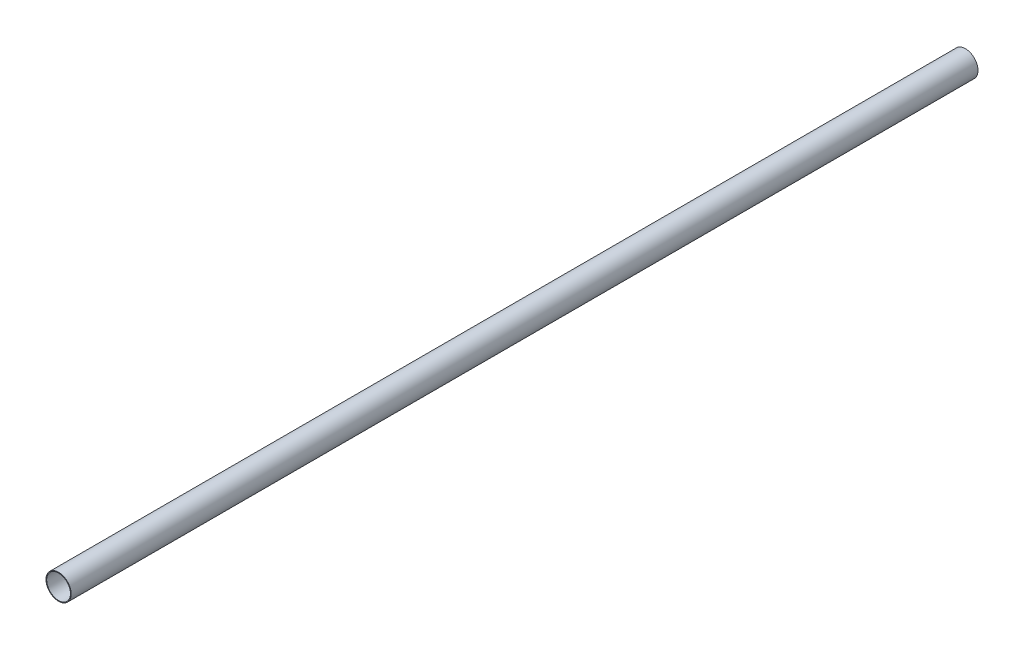
ISO-10303-21;
HEADER;
FILE_DESCRIPTION(('STEP AP214'),'2;1');
FILE_NAME('part.step','',(''),(''),'','','');
FILE_SCHEMA(('AUTOMOTIVE_DESIGN { 1 0 10303 214 1 1 1 1 }'));
ENDSEC;
DATA;
#1=APPLICATION_CONTEXT('core data for automotive mechanical design processes');
#2=APPLICATION_PROTOCOL_DEFINITION('international standard','automotive_design',2000,#1);
#3=PRODUCT_CONTEXT('',#1,'mechanical');
#4=PRODUCT('Part','Part','',(#3));
#5=PRODUCT_RELATED_PRODUCT_CATEGORY('part','',(#4));
#6=PRODUCT_DEFINITION_FORMATION('','',#4);
#7=PRODUCT_DEFINITION_CONTEXT('part definition',#1,'design');
#8=PRODUCT_DEFINITION('design','',#6,#7);
#9=PRODUCT_DEFINITION_SHAPE('','',#8);
#10=(LENGTH_UNIT() NAMED_UNIT(*) SI_UNIT(.MILLI.,.METRE.));
#11=(NAMED_UNIT(*) PLANE_ANGLE_UNIT() SI_UNIT($,.RADIAN.));
#12=(NAMED_UNIT(*) SI_UNIT($,.STERADIAN.) SOLID_ANGLE_UNIT());
#13=UNCERTAINTY_MEASURE_WITH_UNIT(LENGTH_MEASURE(1.E-05),#10,'distance_accuracy_value','');
#14=(GEOMETRIC_REPRESENTATION_CONTEXT(3) GLOBAL_UNCERTAINTY_ASSIGNED_CONTEXT((#13)) GLOBAL_UNIT_ASSIGNED_CONTEXT((#10,
#11,#12)) REPRESENTATION_CONTEXT('',''));
#15=CARTESIAN_POINT('',(0.,0.,0.));
#16=DIRECTION('',(0.,0.,1.));
#17=DIRECTION('',(1.,0.,0.));
#18=AXIS2_PLACEMENT_3D('',#15,#16,#17);
#19=CARTESIAN_POINT('',(0.,0.,457.2));
#20=DIRECTION('',(0.,0.,1.));
#21=DIRECTION('',(1.,0.,0.));
#22=AXIS2_PLACEMENT_3D('',#19,#20,#21);
#23=PLANE('',#22);
#24=CARTESIAN_POINT('',(0.,0.,457.2));
#25=DIRECTION('',(0.,0.,1.));
#26=DIRECTION('',(1.,0.,0.));
#27=AXIS2_PLACEMENT_3D('',#24,#25,#26);
#28=CIRCLE('',#27,12.7);
#29=CARTESIAN_POINT('',(12.7,0.,457.2));
#30=VERTEX_POINT('',#29);
#31=EDGE_CURVE('E10',#30,#30,#28,.T.);
#32=ORIENTED_EDGE('',*,*,#31,.T.);
#33=EDGE_LOOP('',(#32));
#34=FACE_BOUND('',#33,.T.);
#35=CARTESIAN_POINT('',(0.,0.,457.2));
#36=DIRECTION('',(0.,0.,1.));
#37=DIRECTION('',(1.,0.,0.));
#38=AXIS2_PLACEMENT_3D('',#35,#36,#37);
#39=CIRCLE('',#38,11.9888);
#40=CARTESIAN_POINT('',(11.9888,0.,457.2));
#41=VERTEX_POINT('',#40);
#42=EDGE_CURVE('E41',#41,#41,#39,.T.);
#43=ORIENTED_EDGE('',*,*,#42,.F.);
#44=EDGE_LOOP('',(#43));
#45=FACE_BOUND('',#44,.T.);
#46=ADVANCED_FACE('F30',(#34,#45),#23,.T.);
#47=CARTESIAN_POINT('',(0.,0.,-457.2));
#48=DIRECTION('',(0.,0.,1.));
#49=DIRECTION('',(1.,0.,0.));
#50=AXIS2_PLACEMENT_3D('',#47,#48,#49);
#51=PLANE('',#50);
#52=CARTESIAN_POINT('',(0.,0.,-457.2));
#53=DIRECTION('',(0.,0.,1.));
#54=DIRECTION('',(1.,0.,0.));
#55=AXIS2_PLACEMENT_3D('',#52,#53,#54);
#56=CIRCLE('',#55,12.7);
#57=CARTESIAN_POINT('',(12.7,0.,-457.2));
#58=VERTEX_POINT('',#57);
#59=EDGE_CURVE('E34',#58,#58,#56,.T.);
#60=ORIENTED_EDGE('',*,*,#59,.F.);
#61=EDGE_LOOP('',(#60));
#62=FACE_BOUND('',#61,.T.);
#63=CARTESIAN_POINT('',(0.,0.,-457.2));
#64=DIRECTION('',(0.,0.,1.));
#65=DIRECTION('',(1.,0.,0.));
#66=AXIS2_PLACEMENT_3D('',#63,#64,#65);
#67=CIRCLE('',#66,11.9888);
#68=CARTESIAN_POINT('',(11.9888,0.,-457.2));
#69=VERTEX_POINT('',#68);
#70=EDGE_CURVE('E43',#69,#69,#67,.T.);
#71=ORIENTED_EDGE('',*,*,#70,.T.);
#72=EDGE_LOOP('',(#71));
#73=FACE_BOUND('',#72,.T.);
#74=ADVANCED_FACE('F53',(#62,#73),#51,.F.);
#75=CARTESIAN_POINT('',(0.,0.,457.2));
#76=DIRECTION('',(0.,0.,-1.));
#77=DIRECTION('',(-1.,0.,0.));
#78=AXIS2_PLACEMENT_3D('',#75,#76,#77);
#79=CYLINDRICAL_SURFACE('',#78,12.7);
#80=ORIENTED_EDGE('',*,*,#31,.F.);
#81=EDGE_LOOP('',(#80));
#82=FACE_BOUND('',#81,.T.);
#83=ORIENTED_EDGE('',*,*,#59,.T.);
#84=EDGE_LOOP('',(#83));
#85=FACE_BOUND('',#84,.T.);
#86=ADVANCED_FACE('F32',(#82,#85),#79,.T.);
#87=CARTESIAN_POINT('',(0.,0.,457.2));
#88=DIRECTION('',(0.,0.,-1.));
#89=DIRECTION('',(-1.,0.,0.));
#90=AXIS2_PLACEMENT_3D('',#87,#88,#89);
#91=CYLINDRICAL_SURFACE('',#90,11.9888);
#92=ORIENTED_EDGE('',*,*,#42,.T.);
#93=EDGE_LOOP('',(#92));
#94=FACE_BOUND('',#93,.T.);
#95=ORIENTED_EDGE('',*,*,#70,.F.);
#96=EDGE_LOOP('',(#95));
#97=FACE_BOUND('',#96,.T.);
#98=ADVANCED_FACE('F49',(#94,#97),#91,.F.);
#99=CLOSED_SHELL('',(#46,#74,#86,#98));
#100=MANIFOLD_SOLID_BREP('B2',#99);
#101=ADVANCED_BREP_SHAPE_REPRESENTATION('',(#18,#100),#14);
#102=SHAPE_DEFINITION_REPRESENTATION(#9,#101);
ENDSEC;
END-ISO-10303-21;
